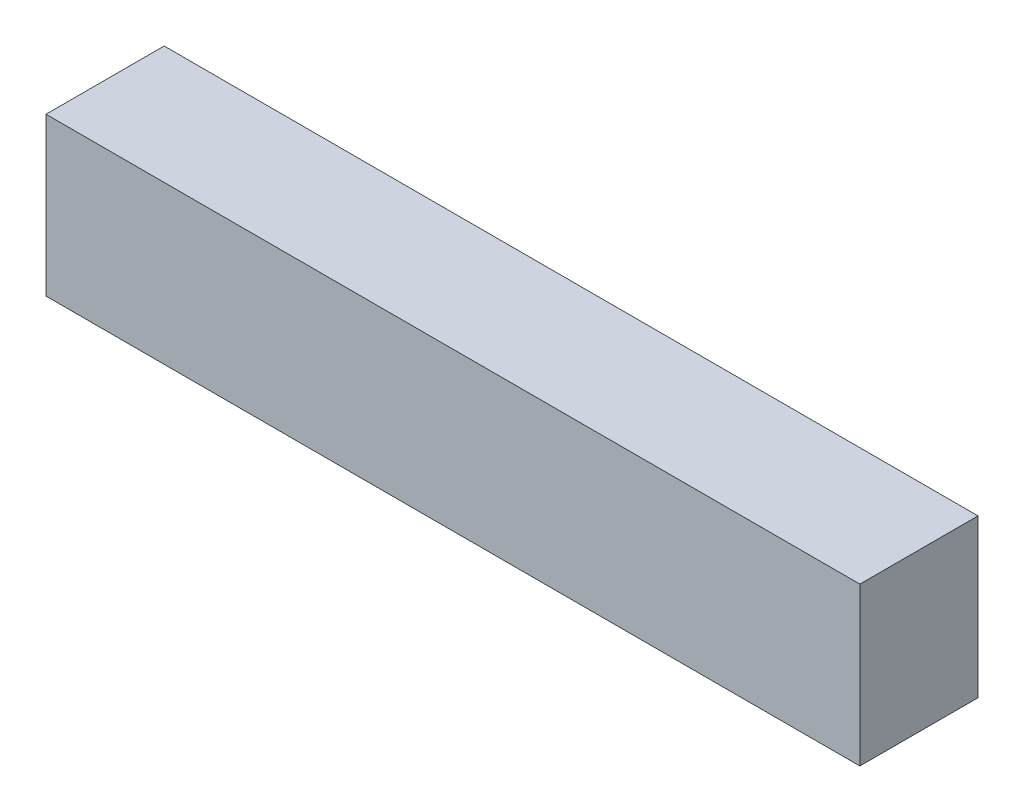
ISO-10303-21;
HEADER;
FILE_DESCRIPTION(('STEP AP214'),'2;1');
FILE_NAME('part.step','',(''),(''),'','','');
FILE_SCHEMA(('AUTOMOTIVE_DESIGN { 1 0 10303 214 1 1 1 1 }'));
ENDSEC;
DATA;
#1=APPLICATION_CONTEXT('core data for automotive mechanical design processes');
#2=APPLICATION_PROTOCOL_DEFINITION('international standard','automotive_design',2000,#1);
#3=PRODUCT_CONTEXT('',#1,'mechanical');
#4=PRODUCT('Part','Part','',(#3));
#5=PRODUCT_RELATED_PRODUCT_CATEGORY('part','',(#4));
#6=PRODUCT_DEFINITION_FORMATION('','',#4);
#7=PRODUCT_DEFINITION_CONTEXT('part definition',#1,'design');
#8=PRODUCT_DEFINITION('design','',#6,#7);
#9=PRODUCT_DEFINITION_SHAPE('','',#8);
#10=(LENGTH_UNIT() NAMED_UNIT(*) SI_UNIT(.MILLI.,.METRE.));
#11=(NAMED_UNIT(*) PLANE_ANGLE_UNIT() SI_UNIT($,.RADIAN.));
#12=(NAMED_UNIT(*) SI_UNIT($,.STERADIAN.) SOLID_ANGLE_UNIT());
#13=UNCERTAINTY_MEASURE_WITH_UNIT(LENGTH_MEASURE(1.E-05),#10,'distance_accuracy_value','');
#14=(GEOMETRIC_REPRESENTATION_CONTEXT(3) GLOBAL_UNCERTAINTY_ASSIGNED_CONTEXT((#13)) GLOBAL_UNIT_ASSIGNED_CONTEXT((#10,
#11,#12)) REPRESENTATION_CONTEXT('',''));
#15=CARTESIAN_POINT('',(0.,0.,0.));
#16=DIRECTION('',(0.,0.,1.));
#17=DIRECTION('',(1.,0.,0.));
#18=AXIS2_PLACEMENT_3D('',#15,#16,#17);
#19=CARTESIAN_POINT('',(450.,470.,-10.));
#20=DIRECTION('',(0.,1.,0.));
#21=DIRECTION('',(0.,0.,1.));
#22=AXIS2_PLACEMENT_3D('',#19,#20,#21);
#23=PLANE('',#22);
#24=DIRECTION('',(0.,0.,-1.));
#25=VECTOR('',#24,1.);
#26=CARTESIAN_POINT('',(200.,470.,0.));
#27=LINE('',#26,#25);
#28=CARTESIAN_POINT('',(200.,470.,225.));
#29=VERTEX_POINT('',#28);
#30=CARTESIAN_POINT('',(200.,470.,0.));
#31=VERTEX_POINT('',#30);
#32=EDGE_CURVE('E455',#29,#31,#27,.T.);
#33=ORIENTED_EDGE('',*,*,#32,.F.);
#34=DIRECTION('',(-1.,0.,0.));
#35=VECTOR('',#34,1.);
#36=CARTESIAN_POINT('',(450.,470.,225.));
#37=LINE('',#36,#35);
#38=CARTESIAN_POINT('',(0.,470.,225.));
#39=VERTEX_POINT('',#38);
#40=EDGE_CURVE('E219',#29,#39,#37,.T.);
#41=ORIENTED_EDGE('',*,*,#40,.T.);
#42=DIRECTION('',(0.,0.,1.));
#43=VECTOR('',#42,1.);
#44=CARTESIAN_POINT('',(0.,470.,900.));
#45=LINE('',#44,#43);
#46=CARTESIAN_POINT('',(0.,470.,0.));
#47=VERTEX_POINT('',#46);
#48=EDGE_CURVE('E221',#47,#39,#45,.T.);
#49=ORIENTED_EDGE('',*,*,#48,.F.);
#50=DIRECTION('',(-1.,0.,0.));
#51=VECTOR('',#50,1.);
#52=CARTESIAN_POINT('',(300.,470.,0.));
#53=LINE('',#52,#51);
#54=EDGE_CURVE('E287',#31,#47,#53,.T.);
#55=ORIENTED_EDGE('',*,*,#54,.F.);
#56=EDGE_LOOP('',(#33,#41,#49,#55));
#57=FACE_BOUND('',#56,.T.);
#58=ADVANCED_FACE('F57',(#57),#23,.F.);
#59=CARTESIAN_POINT('',(450.,470.,225.));
#60=DIRECTION('',(0.,0.,-1.));
#61=DIRECTION('',(-1.,0.,0.));
#62=AXIS2_PLACEMENT_3D('',#59,#60,#61);
#63=PLANE('',#62);
#64=DIRECTION('',(0.,-1.,0.));
#65=VECTOR('',#64,1.);
#66=CARTESIAN_POINT('',(200.,470.,225.));
#67=LINE('',#66,#65);
#68=CARTESIAN_POINT('',(200.,820.,225.));
#69=VERTEX_POINT('',#68);
#70=EDGE_CURVE('E426',#69,#29,#67,.T.);
#71=ORIENTED_EDGE('',*,*,#70,.F.);
#72=DIRECTION('',(-1.,0.,0.));
#73=VECTOR('',#72,1.);
#74=CARTESIAN_POINT('',(450.,820.,225.));
#75=LINE('',#74,#73);
#76=CARTESIAN_POINT('',(0.,820.,225.));
#77=VERTEX_POINT('',#76);
#78=EDGE_CURVE('E421',#69,#77,#75,.T.);
#79=ORIENTED_EDGE('',*,*,#78,.T.);
#80=DIRECTION('',(0.,1.,0.));
#81=VECTOR('',#80,1.);
#82=CARTESIAN_POINT('',(0.,1200.,225.));
#83=LINE('',#82,#81);
#84=EDGE_CURVE('E290',#39,#77,#83,.T.);
#85=ORIENTED_EDGE('',*,*,#84,.F.);
#86=ORIENTED_EDGE('',*,*,#40,.F.);
#87=EDGE_LOOP('',(#71,#79,#85,#86));
#88=FACE_BOUND('',#87,.T.);
#89=ADVANCED_FACE('F349',(#88),#63,.F.);
#90=CARTESIAN_POINT('',(450.,820.,-10.));
#91=DIRECTION('',(0.,-1.,0.));
#92=DIRECTION('',(0.,0.,-1.));
#93=AXIS2_PLACEMENT_3D('',#90,#91,#92);
#94=PLANE('',#93);
#95=DIRECTION('',(0.,0.,1.));
#96=VECTOR('',#95,1.);
#97=CARTESIAN_POINT('',(200.,820.,0.));
#98=LINE('',#97,#96);
#99=CARTESIAN_POINT('',(200.,820.,0.));
#100=VERTEX_POINT('',#99);
#101=EDGE_CURVE('E212',#100,#69,#98,.T.);
#102=ORIENTED_EDGE('',*,*,#101,.F.);
#103=DIRECTION('',(1.,0.,0.));
#104=VECTOR('',#103,1.);
#105=CARTESIAN_POINT('',(300.,820.,0.));
#106=LINE('',#105,#104);
#107=CARTESIAN_POINT('',(0.,820.,0.));
#108=VERTEX_POINT('',#107);
#109=EDGE_CURVE('E284',#108,#100,#106,.T.);
#110=ORIENTED_EDGE('',*,*,#109,.F.);
#111=DIRECTION('',(0.,0.,-1.));
#112=VECTOR('',#111,1.);
#113=CARTESIAN_POINT('',(0.,820.,900.));
#114=LINE('',#113,#112);
#115=EDGE_CURVE('E218',#77,#108,#114,.T.);
#116=ORIENTED_EDGE('',*,*,#115,.F.);
#117=ORIENTED_EDGE('',*,*,#78,.F.);
#118=EDGE_LOOP('',(#102,#110,#116,#117));
#119=FACE_BOUND('',#118,.T.);
#120=ADVANCED_FACE('F356',(#119),#94,.F.);
#121=CARTESIAN_POINT('',(22000.,0.,0.));
#122=DIRECTION('',(0.,0.,1.));
#123=DIRECTION('',(1.,0.,0.));
#124=AXIS2_PLACEMENT_3D('',#121,#122,#123);
#125=PLANE('',#124);
#126=DIRECTION('',(0.,1.,0.));
#127=VECTOR('',#126,1.);
#128=CARTESIAN_POINT('',(-9000.,0.,0.));
#129=LINE('',#128,#127);
#130=CARTESIAN_POINT('',(-9000.,0.,0.));
#131=VERTEX_POINT('',#130);
#132=CARTESIAN_POINT('',(-9000.,6000.,0.));
#133=VERTEX_POINT('',#132);
#134=EDGE_CURVE('E310',#131,#133,#129,.T.);
#135=ORIENTED_EDGE('',*,*,#134,.T.);
#136=DIRECTION('',(-1.,0.,0.));
#137=VECTOR('',#136,1.);
#138=CARTESIAN_POINT('',(22000.,6000.,0.));
#139=LINE('',#138,#137);
#140=CARTESIAN_POINT('',(22000.,6000.,0.));
#141=VERTEX_POINT('',#140);
#142=EDGE_CURVE('E315',#141,#133,#139,.T.);
#143=ORIENTED_EDGE('',*,*,#142,.F.);
#144=DIRECTION('',(0.,1.,0.));
#145=VECTOR('',#144,1.);
#146=CARTESIAN_POINT('',(22000.,0.,0.));
#147=LINE('',#146,#145);
#148=CARTESIAN_POINT('',(22000.,0.,0.));
#149=VERTEX_POINT('',#148);
#150=EDGE_CURVE('E301',#149,#141,#147,.T.);
#151=ORIENTED_EDGE('',*,*,#150,.F.);
#152=DIRECTION('',(-1.,0.,0.));
#153=VECTOR('',#152,1.);
#154=CARTESIAN_POINT('',(22000.,0.,0.));
#155=LINE('',#154,#153);
#156=EDGE_CURVE('E65',#149,#131,#155,.T.);
#157=ORIENTED_EDGE('',*,*,#156,.T.);
#158=EDGE_LOOP('',(#135,#143,#151,#157));
#159=FACE_BOUND('',#158,.T.);
#160=CARTESIAN_POINT('',(300.000000000001,470.,0.));
#161=VERTEX_POINT('',#160);
#162=CARTESIAN_POINT('',(225.,470.,0.));
#163=VERTEX_POINT('',#162);
#164=EDGE_CURVE('E288',#161,#163,#53,.T.);
#165=ORIENTED_EDGE('',*,*,#164,.T.);
#166=DIRECTION('',(0.,1.,0.));
#167=VECTOR('',#166,1.);
#168=CARTESIAN_POINT('',(225.,470.,0.));
#169=LINE('',#168,#167);
#170=CARTESIAN_POINT('',(225.,820.,0.));
#171=VERTEX_POINT('',#170);
#172=EDGE_CURVE('E198',#163,#171,#169,.T.);
#173=ORIENTED_EDGE('',*,*,#172,.T.);
#174=CARTESIAN_POINT('',(450.,820.,0.));
#175=VERTEX_POINT('',#174);
#176=EDGE_CURVE('E283',#171,#175,#106,.T.);
#177=ORIENTED_EDGE('',*,*,#176,.T.);
#178=DIRECTION('',(0.,1.,0.));
#179=VECTOR('',#178,1.);
#180=CARTESIAN_POINT('',(450.,450.,0.));
#181=LINE('',#180,#179);
#182=CARTESIAN_POINT('',(449.999999999999,150.,0.));
#183=VERTEX_POINT('',#182);
#184=EDGE_CURVE('E280',#183,#175,#181,.T.);
#185=ORIENTED_EDGE('',*,*,#184,.F.);
#186=DIRECTION('',(1.,0.,0.));
#187=VECTOR('',#186,1.);
#188=CARTESIAN_POINT('',(300.,150.,0.));
#189=LINE('',#188,#187);
#190=CARTESIAN_POINT('',(4400.,150.,0.));
#191=VERTEX_POINT('',#190);
#192=EDGE_CURVE('E248',#183,#191,#189,.T.);
#193=ORIENTED_EDGE('',*,*,#192,.T.);
#194=DIRECTION('',(0.,1.,0.));
#195=VECTOR('',#194,1.);
#196=CARTESIAN_POINT('',(4400.,150.,0.));
#197=LINE('',#196,#195);
#198=CARTESIAN_POINT('',(4400.,1126.953873476,0.));
#199=VERTEX_POINT('',#198);
#200=EDGE_CURVE('E251',#191,#199,#197,.T.);
#201=ORIENTED_EDGE('',*,*,#200,.T.);
#202=DIRECTION('',(-0.90630778703665,0.422618261740699,0.));
#203=VECTOR('',#202,1.);
#204=CARTESIAN_POINT('',(4400.,1126.953873476,0.));
#205=LINE('',#204,#203);
#206=CARTESIAN_POINT('',(3600.,1500.,0.));
#207=VERTEX_POINT('',#206);
#208=EDGE_CURVE('E254',#199,#207,#205,.T.);
#209=ORIENTED_EDGE('',*,*,#208,.T.);
#210=DIRECTION('',(-1.,0.,0.));
#211=VECTOR('',#210,1.);
#212=CARTESIAN_POINT('',(3600.,1500.,0.));
#213=LINE('',#212,#211);
#214=CARTESIAN_POINT('',(300.,1500.,0.));
#215=VERTEX_POINT('',#214);
#216=EDGE_CURVE('E257',#207,#215,#213,.T.);
#217=ORIENTED_EDGE('',*,*,#216,.T.);
#218=CARTESIAN_POINT('',(300.,1200.,0.));
#219=DIRECTION('',(0.,0.,1.));
#220=DIRECTION('',(1.,0.,0.));
#221=AXIS2_PLACEMENT_3D('',#218,#219,#220);
#222=CIRCLE('',#221,300.);
#223=CARTESIAN_POINT('',(0.,1200.,0.));
#224=VERTEX_POINT('',#223);
#225=EDGE_CURVE('E260',#215,#224,#222,.T.);
#226=ORIENTED_EDGE('',*,*,#225,.T.);
#227=DIRECTION('',(0.,-1.,0.));
#228=VECTOR('',#227,1.);
#229=CARTESIAN_POINT('',(0.,1200.,0.));
#230=LINE('',#229,#228);
#231=EDGE_CURVE('E233',#224,#108,#230,.T.);
#232=ORIENTED_EDGE('',*,*,#231,.T.);
#233=ORIENTED_EDGE('',*,*,#109,.T.);
#234=DIRECTION('',(0.,1.,0.));
#235=VECTOR('',#234,1.);
#236=CARTESIAN_POINT('',(200.,470.,0.));
#237=LINE('',#236,#235);
#238=EDGE_CURVE('E72',#31,#100,#237,.T.);
#239=ORIENTED_EDGE('',*,*,#238,.F.);
#240=ORIENTED_EDGE('',*,*,#54,.T.);
#241=CARTESIAN_POINT('',(0.,450.,0.));
#242=VERTEX_POINT('',#241);
#243=EDGE_CURVE('E263',#47,#242,#230,.T.);
#244=ORIENTED_EDGE('',*,*,#243,.T.);
#245=CARTESIAN_POINT('',(300.,450.,0.));
#246=DIRECTION('',(0.,0.,1.));
#247=DIRECTION('',(1.,0.,0.));
#248=AXIS2_PLACEMENT_3D('',#245,#246,#247);
#249=CIRCLE('',#248,300.);
#250=CARTESIAN_POINT('',(300.,150.,0.));
#251=VERTEX_POINT('',#250);
#252=EDGE_CURVE('E228',#242,#251,#249,.T.);
#253=ORIENTED_EDGE('',*,*,#252,.T.);
#254=DIRECTION('',(0.,1.,0.));
#255=VECTOR('',#254,1.);
#256=CARTESIAN_POINT('',(300.,450.,0.));
#257=LINE('',#256,#255);
#258=EDGE_CURVE('E418',#251,#161,#257,.T.);
#259=ORIENTED_EDGE('',*,*,#258,.T.);
#260=EDGE_LOOP('',(#165,#173,#177,#185,#193,#201,#209,#217,#226,#232,#233,#239,#240,#244,#253,#259));
#261=FACE_BOUND('',#260,.T.);
#262=ADVANCED_FACE('F322',(#159,#261),#125,.F.);
#263=CARTESIAN_POINT('',(22000.,0.,4500.));
#264=DIRECTION('',(0.,0.,-1.));
#265=DIRECTION('',(-1.,0.,0.));
#266=AXIS2_PLACEMENT_3D('',#263,#264,#265);
#267=PLANE('',#266);
#268=DIRECTION('',(0.,-1.,0.));
#269=VECTOR('',#268,1.);
#270=CARTESIAN_POINT('',(-9000.,0.,4500.));
#271=LINE('',#270,#269);
#272=CARTESIAN_POINT('',(-9000.,6000.,4500.));
#273=VERTEX_POINT('',#272);
#274=CARTESIAN_POINT('',(-9000.,0.,4500.));
#275=VERTEX_POINT('',#274);
#276=EDGE_CURVE('E294',#273,#275,#271,.T.);
#277=ORIENTED_EDGE('',*,*,#276,.T.);
#278=DIRECTION('',(-1.,0.,0.));
#279=VECTOR('',#278,1.);
#280=CARTESIAN_POINT('',(22000.,0.,4500.));
#281=LINE('',#280,#279);
#282=CARTESIAN_POINT('',(22000.,0.,4500.));
#283=VERTEX_POINT('',#282);
#284=EDGE_CURVE('E12',#283,#275,#281,.T.);
#285=ORIENTED_EDGE('',*,*,#284,.F.);
#286=DIRECTION('',(0.,-1.,0.));
#287=VECTOR('',#286,1.);
#288=CARTESIAN_POINT('',(22000.,0.,4500.));
#289=LINE('',#288,#287);
#290=CARTESIAN_POINT('',(22000.,6000.,4500.));
#291=VERTEX_POINT('',#290);
#292=EDGE_CURVE('E295',#291,#283,#289,.T.);
#293=ORIENTED_EDGE('',*,*,#292,.F.);
#294=DIRECTION('',(-1.,0.,0.));
#295=VECTOR('',#294,1.);
#296=CARTESIAN_POINT('',(22000.,6000.,4500.));
#297=LINE('',#296,#295);
#298=EDGE_CURVE('E305',#291,#273,#297,.T.);
#299=ORIENTED_EDGE('',*,*,#298,.T.);
#300=EDGE_LOOP('',(#277,#285,#293,#299));
#301=FACE_BOUND('',#300,.T.);
#302=ADVANCED_FACE('F59',(#301),#267,.F.);
#303=CARTESIAN_POINT('',(22000.,0.,0.));
#304=DIRECTION('',(0.,1.,0.));
#305=DIRECTION('',(0.,0.,1.));
#306=AXIS2_PLACEMENT_3D('',#303,#304,#305);
#307=PLANE('',#306);
#308=DIRECTION('',(0.,0.,-1.));
#309=VECTOR('',#308,1.);
#310=CARTESIAN_POINT('',(-9000.,0.,0.));
#311=LINE('',#310,#309);
#312=EDGE_CURVE('E308',#275,#131,#311,.T.);
#313=ORIENTED_EDGE('',*,*,#312,.T.);
#314=ORIENTED_EDGE('',*,*,#156,.F.);
#315=DIRECTION('',(0.,0.,-1.));
#316=VECTOR('',#315,1.);
#317=CARTESIAN_POINT('',(22000.,0.,0.));
#318=LINE('',#317,#316);
#319=EDGE_CURVE('E298',#283,#149,#318,.T.);
#320=ORIENTED_EDGE('',*,*,#319,.F.);
#321=ORIENTED_EDGE('',*,*,#284,.T.);
#322=EDGE_LOOP('',(#313,#314,#320,#321));
#323=FACE_BOUND('',#322,.T.);
#324=ADVANCED_FACE('F339',(#323),#307,.F.);
#325=CARTESIAN_POINT('',(22000.,6000.,0.));
#326=DIRECTION('',(0.,-1.,0.));
#327=DIRECTION('',(0.,0.,-1.));
#328=AXIS2_PLACEMENT_3D('',#325,#326,#327);
#329=PLANE('',#328);
#330=DIRECTION('',(0.,0.,1.));
#331=VECTOR('',#330,1.);
#332=CARTESIAN_POINT('',(-9000.,6000.,0.));
#333=LINE('',#332,#331);
#334=EDGE_CURVE('E299',#133,#273,#333,.T.);
#335=ORIENTED_EDGE('',*,*,#334,.T.);
#336=ORIENTED_EDGE('',*,*,#298,.F.);
#337=DIRECTION('',(0.,0.,1.));
#338=VECTOR('',#337,1.);
#339=CARTESIAN_POINT('',(22000.,6000.,0.));
#340=LINE('',#339,#338);
#341=EDGE_CURVE('E303',#141,#291,#340,.T.);
#342=ORIENTED_EDGE('',*,*,#341,.F.);
#343=ORIENTED_EDGE('',*,*,#142,.T.);
#344=EDGE_LOOP('',(#335,#336,#342,#343));
#345=FACE_BOUND('',#344,.T.);
#346=ADVANCED_FACE('F332',(#345),#329,.F.);
#347=CARTESIAN_POINT('',(22000.,0.,0.));
#348=DIRECTION('',(1.,0.,0.));
#349=DIRECTION('',(0.,0.,-1.));
#350=AXIS2_PLACEMENT_3D('',#347,#348,#349);
#351=PLANE('',#350);
#352=ORIENTED_EDGE('',*,*,#292,.T.);
#353=ORIENTED_EDGE('',*,*,#319,.T.);
#354=ORIENTED_EDGE('',*,*,#150,.T.);
#355=ORIENTED_EDGE('',*,*,#341,.T.);
#356=EDGE_LOOP('',(#352,#353,#354,#355));
#357=FACE_BOUND('',#356,.T.);
#358=ADVANCED_FACE('F338',(#357),#351,.T.);
#359=CARTESIAN_POINT('',(-9000.,0.,0.));
#360=DIRECTION('',(1.,0.,0.));
#361=DIRECTION('',(0.,0.,-1.));
#362=AXIS2_PLACEMENT_3D('',#359,#360,#361);
#363=PLANE('',#362);
#364=ORIENTED_EDGE('',*,*,#276,.F.);
#365=ORIENTED_EDGE('',*,*,#334,.F.);
#366=ORIENTED_EDGE('',*,*,#134,.F.);
#367=ORIENTED_EDGE('',*,*,#312,.F.);
#368=EDGE_LOOP('',(#364,#365,#366,#367));
#369=FACE_BOUND('',#368,.T.);
#370=ADVANCED_FACE('F329',(#369),#363,.F.);
#371=CARTESIAN_POINT('',(300.,150.,900.));
#372=DIRECTION('',(0.,1.,0.));
#373=DIRECTION('',(0.,0.,1.));
#374=AXIS2_PLACEMENT_3D('',#371,#372,#373);
#375=PLANE('',#374);
#376=DIRECTION('',(-1.,0.,0.));
#377=VECTOR('',#376,1.);
#378=CARTESIAN_POINT('',(300.,150.,225.));
#379=LINE('',#378,#377);
#380=CARTESIAN_POINT('',(450.,150.,225.));
#381=VERTEX_POINT('',#380);
#382=CARTESIAN_POINT('',(300.,150.,225.));
#383=VERTEX_POINT('',#382);
#384=EDGE_CURVE('E445',#381,#383,#379,.T.);
#385=ORIENTED_EDGE('',*,*,#384,.T.);
#386=DIRECTION('',(0.,0.,-1.));
#387=VECTOR('',#386,1.);
#388=CARTESIAN_POINT('',(300.,150.,900.));
#389=LINE('',#388,#387);
#390=CARTESIAN_POINT('',(300.,150.,900.));
#391=VERTEX_POINT('',#390);
#392=EDGE_CURVE('E277',#391,#383,#389,.T.);
#393=ORIENTED_EDGE('',*,*,#392,.F.);
#394=DIRECTION('',(1.,0.,0.));
#395=VECTOR('',#394,1.);
#396=CARTESIAN_POINT('',(300.,150.,900.));
#397=LINE('',#396,#395);
#398=CARTESIAN_POINT('',(4400.,150.,900.));
#399=VERTEX_POINT('',#398);
#400=EDGE_CURVE('E232',#391,#399,#397,.T.);
#401=ORIENTED_EDGE('',*,*,#400,.T.);
#402=DIRECTION('',(0.,0.,-1.));
#403=VECTOR('',#402,1.);
#404=CARTESIAN_POINT('',(4400.,150.,900.));
#405=LINE('',#404,#403);
#406=EDGE_CURVE('E275',#399,#191,#405,.T.);
#407=ORIENTED_EDGE('',*,*,#406,.T.);
#408=ORIENTED_EDGE('',*,*,#192,.F.);
#409=DIRECTION('',(0.,0.,-1.));
#410=VECTOR('',#409,1.);
#411=CARTESIAN_POINT('',(450.,150.,900.));
#412=LINE('',#411,#410);
#413=EDGE_CURVE('E412',#381,#183,#412,.T.);
#414=ORIENTED_EDGE('',*,*,#413,.F.);
#415=EDGE_LOOP('',(#385,#393,#401,#407,#408,#414));
#416=FACE_BOUND('',#415,.T.);
#417=ADVANCED_FACE('F363',(#416),#375,.T.);
#418=CARTESIAN_POINT('',(300.,470.,225.));
#419=VERTEX_POINT('',#418);
#420=CARTESIAN_POINT('',(225.,470.,225.));
#421=VERTEX_POINT('',#420);
#422=EDGE_CURVE('E208',#419,#421,#37,.T.);
#423=ORIENTED_EDGE('',*,*,#422,.T.);
#424=DIRECTION('',(0.,0.,-1.));
#425=VECTOR('',#424,1.);
#426=CARTESIAN_POINT('',(225.,470.,0.));
#427=LINE('',#426,#425);
#428=EDGE_CURVE('E195',#421,#163,#427,.T.);
#429=ORIENTED_EDGE('',*,*,#428,.T.);
#430=ORIENTED_EDGE('',*,*,#164,.F.);
#431=DIRECTION('',(0.,0.,-1.));
#432=VECTOR('',#431,1.);
#433=CARTESIAN_POINT('',(300.,470.,-10.));
#434=LINE('',#433,#432);
#435=EDGE_CURVE('E216',#419,#161,#434,.T.);
#436=ORIENTED_EDGE('',*,*,#435,.F.);
#437=EDGE_LOOP('',(#423,#429,#430,#436));
#438=FACE_BOUND('',#437,.T.);
#439=ADVANCED_FACE('F214',(#438),#23,.F.);
#440=CARTESIAN_POINT('',(0.,1200.,900.));
#441=DIRECTION('',(1.,0.,0.));
#442=DIRECTION('',(0.,0.,-1.));
#443=AXIS2_PLACEMENT_3D('',#440,#441,#442);
#444=PLANE('',#443);
#445=ORIENTED_EDGE('',*,*,#48,.T.);
#446=ORIENTED_EDGE('',*,*,#84,.T.);
#447=ORIENTED_EDGE('',*,*,#115,.T.);
#448=ORIENTED_EDGE('',*,*,#231,.F.);
#449=DIRECTION('',(0.,0.,-1.));
#450=VECTOR('',#449,1.);
#451=CARTESIAN_POINT('',(0.,1200.,900.));
#452=LINE('',#451,#450);
#453=CARTESIAN_POINT('',(0.,1200.,900.));
#454=VERTEX_POINT('',#453);
#455=EDGE_CURVE('E267',#454,#224,#452,.T.);
#456=ORIENTED_EDGE('',*,*,#455,.F.);
#457=DIRECTION('',(0.,-1.,0.));
#458=VECTOR('',#457,1.);
#459=CARTESIAN_POINT('',(0.,1200.,900.));
#460=LINE('',#459,#458);
#461=CARTESIAN_POINT('',(0.,450.,900.));
#462=VERTEX_POINT('',#461);
#463=EDGE_CURVE('E243',#454,#462,#460,.T.);
#464=ORIENTED_EDGE('',*,*,#463,.T.);
#465=DIRECTION('',(0.,0.,-1.));
#466=VECTOR('',#465,1.);
#467=CARTESIAN_POINT('',(0.,450.,900.));
#468=LINE('',#467,#466);
#469=EDGE_CURVE('E245',#462,#242,#468,.T.);
#470=ORIENTED_EDGE('',*,*,#469,.T.);
#471=ORIENTED_EDGE('',*,*,#243,.F.);
#472=EDGE_LOOP('',(#445,#446,#447,#448,#456,#464,#470,#471));
#473=FACE_BOUND('',#472,.T.);
#474=ADVANCED_FACE('F362',(#473),#444,.T.);
#475=CARTESIAN_POINT('',(300.,450.,900.));
#476=DIRECTION('',(0.,0.,-1.));
#477=DIRECTION('',(-1.,0.,0.));
#478=AXIS2_PLACEMENT_3D('',#475,#476,#477);
#479=CYLINDRICAL_SURFACE('',#478,300.);
#480=ORIENTED_EDGE('',*,*,#252,.F.);
#481=ORIENTED_EDGE('',*,*,#469,.F.);
#482=CARTESIAN_POINT('',(300.,450.,900.));
#483=DIRECTION('',(0.,0.,1.));
#484=DIRECTION('',(1.,0.,0.));
#485=AXIS2_PLACEMENT_3D('',#482,#483,#484);
#486=CIRCLE('',#485,300.);
#487=EDGE_CURVE('E229',#462,#391,#486,.T.);
#488=ORIENTED_EDGE('',*,*,#487,.T.);
#489=ORIENTED_EDGE('',*,*,#392,.T.);
#490=DIRECTION('',(0.,0.,-1.));
#491=VECTOR('',#490,1.);
#492=CARTESIAN_POINT('',(300.,150.,900.));
#493=LINE('',#492,#491);
#494=EDGE_CURVE('E415',#383,#251,#493,.T.);
#495=ORIENTED_EDGE('',*,*,#494,.T.);
#496=EDGE_LOOP('',(#480,#481,#488,#489,#495));
#497=FACE_BOUND('',#496,.T.);
#498=ADVANCED_FACE('F368',(#497),#479,.F.);
#499=CARTESIAN_POINT('',(4400.,150.,900.));
#500=DIRECTION('',(-1.,0.,0.));
#501=DIRECTION('',(0.,0.,1.));
#502=AXIS2_PLACEMENT_3D('',#499,#500,#501);
#503=PLANE('',#502);
#504=ORIENTED_EDGE('',*,*,#200,.F.);
#505=ORIENTED_EDGE('',*,*,#406,.F.);
#506=DIRECTION('',(0.,1.,0.));
#507=VECTOR('',#506,1.);
#508=CARTESIAN_POINT('',(4400.,150.,900.));
#509=LINE('',#508,#507);
#510=CARTESIAN_POINT('',(4400.,1126.953873476,900.));
#511=VERTEX_POINT('',#510);
#512=EDGE_CURVE('E235',#399,#511,#509,.T.);
#513=ORIENTED_EDGE('',*,*,#512,.T.);
#514=DIRECTION('',(0.,0.,-1.));
#515=VECTOR('',#514,1.);
#516=CARTESIAN_POINT('',(4400.,1126.953873476,900.));
#517=LINE('',#516,#515);
#518=EDGE_CURVE('E273',#511,#199,#517,.T.);
#519=ORIENTED_EDGE('',*,*,#518,.T.);
#520=EDGE_LOOP('',(#504,#505,#513,#519));
#521=FACE_BOUND('',#520,.T.);
#522=ADVANCED_FACE('F380',(#521),#503,.T.);
#523=CARTESIAN_POINT('',(4400.,1126.953873476,900.));
#524=DIRECTION('',(-0.422618261740699,-0.90630778703665,0.));
#525=DIRECTION('',(0.90630778703665,-0.422618261740699,0.));
#526=AXIS2_PLACEMENT_3D('',#523,#524,#525);
#527=PLANE('',#526);
#528=ORIENTED_EDGE('',*,*,#208,.F.);
#529=ORIENTED_EDGE('',*,*,#518,.F.);
#530=DIRECTION('',(-0.90630778703665,0.422618261740699,0.));
#531=VECTOR('',#530,1.);
#532=CARTESIAN_POINT('',(4400.,1126.953873476,900.));
#533=LINE('',#532,#531);
#534=CARTESIAN_POINT('',(3600.,1500.,900.));
#535=VERTEX_POINT('',#534);
#536=EDGE_CURVE('E237',#511,#535,#533,.T.);
#537=ORIENTED_EDGE('',*,*,#536,.T.);
#538=DIRECTION('',(0.,0.,-1.));
#539=VECTOR('',#538,1.);
#540=CARTESIAN_POINT('',(3600.,1500.,900.));
#541=LINE('',#540,#539);
#542=EDGE_CURVE('E271',#535,#207,#541,.T.);
#543=ORIENTED_EDGE('',*,*,#542,.T.);
#544=EDGE_LOOP('',(#528,#529,#537,#543));
#545=FACE_BOUND('',#544,.T.);
#546=ADVANCED_FACE('F538',(#545),#527,.T.);
#547=CARTESIAN_POINT('',(3600.,1500.,900.));
#548=DIRECTION('',(0.,-1.,0.));
#549=DIRECTION('',(0.,0.,-1.));
#550=AXIS2_PLACEMENT_3D('',#547,#548,#549);
#551=PLANE('',#550);
#552=ORIENTED_EDGE('',*,*,#216,.F.);
#553=ORIENTED_EDGE('',*,*,#542,.F.);
#554=DIRECTION('',(-1.,0.,0.));
#555=VECTOR('',#554,1.);
#556=CARTESIAN_POINT('',(3600.,1500.,900.));
#557=LINE('',#556,#555);
#558=CARTESIAN_POINT('',(300.,1500.,900.));
#559=VERTEX_POINT('',#558);
#560=EDGE_CURVE('E239',#535,#559,#557,.T.);
#561=ORIENTED_EDGE('',*,*,#560,.T.);
#562=DIRECTION('',(0.,0.,-1.));
#563=VECTOR('',#562,1.);
#564=CARTESIAN_POINT('',(300.,1500.,900.));
#565=LINE('',#564,#563);
#566=EDGE_CURVE('E269',#559,#215,#565,.T.);
#567=ORIENTED_EDGE('',*,*,#566,.T.);
#568=EDGE_LOOP('',(#552,#553,#561,#567));
#569=FACE_BOUND('',#568,.T.);
#570=ADVANCED_FACE('F528',(#569),#551,.T.);
#571=CARTESIAN_POINT('',(300.,1200.,900.));
#572=DIRECTION('',(0.,0.,-1.));
#573=DIRECTION('',(-1.,0.,0.));
#574=AXIS2_PLACEMENT_3D('',#571,#572,#573);
#575=CYLINDRICAL_SURFACE('',#574,300.);
#576=ORIENTED_EDGE('',*,*,#225,.F.);
#577=ORIENTED_EDGE('',*,*,#566,.F.);
#578=CARTESIAN_POINT('',(300.,1200.,900.));
#579=DIRECTION('',(0.,0.,1.));
#580=DIRECTION('',(1.,0.,0.));
#581=AXIS2_PLACEMENT_3D('',#578,#579,#580);
#582=CIRCLE('',#581,300.);
#583=EDGE_CURVE('E241',#559,#454,#582,.T.);
#584=ORIENTED_EDGE('',*,*,#583,.T.);
#585=ORIENTED_EDGE('',*,*,#455,.T.);
#586=EDGE_LOOP('',(#576,#577,#584,#585));
#587=FACE_BOUND('',#586,.T.);
#588=ADVANCED_FACE('F511',(#587),#575,.F.);
#589=CARTESIAN_POINT('',(300.,450.,900.));
#590=DIRECTION('',(0.,0.,1.));
#591=DIRECTION('',(1.,0.,0.));
#592=AXIS2_PLACEMENT_3D('',#589,#590,#591);
#593=PLANE('',#592);
#594=ORIENTED_EDGE('',*,*,#487,.F.);
#595=ORIENTED_EDGE('',*,*,#463,.F.);
#596=ORIENTED_EDGE('',*,*,#583,.F.);
#597=ORIENTED_EDGE('',*,*,#560,.F.);
#598=ORIENTED_EDGE('',*,*,#536,.F.);
#599=ORIENTED_EDGE('',*,*,#512,.F.);
#600=ORIENTED_EDGE('',*,*,#400,.F.);
#601=EDGE_LOOP('',(#594,#595,#596,#597,#598,#599,#600));
#602=FACE_BOUND('',#601,.T.);
#603=ADVANCED_FACE('F404',(#602),#593,.F.);
#604=CARTESIAN_POINT('',(450.,820.,225.));
#605=VERTEX_POINT('',#604);
#606=CARTESIAN_POINT('',(225.,820.,225.));
#607=VERTEX_POINT('',#606);
#608=EDGE_CURVE('E211',#605,#607,#75,.T.);
#609=ORIENTED_EDGE('',*,*,#608,.T.);
#610=DIRECTION('',(0.,-1.,0.));
#611=VECTOR('',#610,1.);
#612=CARTESIAN_POINT('',(225.,470.,225.));
#613=LINE('',#612,#611);
#614=EDGE_CURVE('E80',#607,#421,#613,.T.);
#615=ORIENTED_EDGE('',*,*,#614,.T.);
#616=ORIENTED_EDGE('',*,*,#422,.F.);
#617=DIRECTION('',(0.,-1.,0.));
#618=VECTOR('',#617,1.);
#619=CARTESIAN_POINT('',(300.,100.,225.));
#620=LINE('',#619,#618);
#621=EDGE_CURVE('E446',#419,#383,#620,.T.);
#622=ORIENTED_EDGE('',*,*,#621,.T.);
#623=ORIENTED_EDGE('',*,*,#384,.F.);
#624=DIRECTION('',(0.,-1.,0.));
#625=VECTOR('',#624,1.);
#626=CARTESIAN_POINT('',(450.,470.,225.));
#627=LINE('',#626,#625);
#628=EDGE_CURVE('E413',#605,#381,#627,.T.);
#629=ORIENTED_EDGE('',*,*,#628,.F.);
#630=EDGE_LOOP('',(#609,#615,#616,#622,#623,#629));
#631=FACE_BOUND('',#630,.T.);
#632=ADVANCED_FACE('F206',(#631),#63,.F.);
#633=ORIENTED_EDGE('',*,*,#176,.F.);
#634=DIRECTION('',(0.,0.,1.));
#635=VECTOR('',#634,1.);
#636=CARTESIAN_POINT('',(225.,820.,0.));
#637=LINE('',#636,#635);
#638=EDGE_CURVE('E407',#171,#607,#637,.T.);
#639=ORIENTED_EDGE('',*,*,#638,.T.);
#640=ORIENTED_EDGE('',*,*,#608,.F.);
#641=DIRECTION('',(0.,0.,1.));
#642=VECTOR('',#641,1.);
#643=CARTESIAN_POINT('',(450.,820.,-10.));
#644=LINE('',#643,#642);
#645=EDGE_CURVE('E408',#175,#605,#644,.T.);
#646=ORIENTED_EDGE('',*,*,#645,.F.);
#647=EDGE_LOOP('',(#633,#639,#640,#646));
#648=FACE_BOUND('',#647,.T.);
#649=ADVANCED_FACE('F391',(#648),#94,.F.);
#650=CARTESIAN_POINT('',(450.,0.,0.));
#651=DIRECTION('',(1.,0.,0.));
#652=DIRECTION('',(0.,0.,-1.));
#653=AXIS2_PLACEMENT_3D('',#650,#651,#652);
#654=PLANE('',#653);
#655=ORIENTED_EDGE('',*,*,#413,.T.);
#656=ORIENTED_EDGE('',*,*,#184,.T.);
#657=ORIENTED_EDGE('',*,*,#645,.T.);
#658=ORIENTED_EDGE('',*,*,#628,.T.);
#659=EDGE_LOOP('',(#655,#656,#657,#658));
#660=FACE_BOUND('',#659,.T.);
#661=ADVANCED_FACE('F396',(#660),#654,.T.);
#662=CARTESIAN_POINT('',(300.,0.,0.));
#663=DIRECTION('',(1.,0.,0.));
#664=DIRECTION('',(0.,0.,-1.));
#665=AXIS2_PLACEMENT_3D('',#662,#663,#664);
#666=PLANE('',#665);
#667=ORIENTED_EDGE('',*,*,#494,.F.);
#668=ORIENTED_EDGE('',*,*,#621,.F.);
#669=ORIENTED_EDGE('',*,*,#435,.T.);
#670=ORIENTED_EDGE('',*,*,#258,.F.);
#671=EDGE_LOOP('',(#667,#668,#669,#670));
#672=FACE_BOUND('',#671,.T.);
#673=ADVANCED_FACE('F402',(#672),#666,.F.);
#674=CARTESIAN_POINT('',(200.,0.,0.));
#675=DIRECTION('',(1.,0.,0.));
#676=DIRECTION('',(0.,0.,-1.));
#677=AXIS2_PLACEMENT_3D('',#674,#675,#676);
#678=PLANE('',#677);
#679=ORIENTED_EDGE('',*,*,#70,.T.);
#680=ORIENTED_EDGE('',*,*,#32,.T.);
#681=ORIENTED_EDGE('',*,*,#238,.T.);
#682=ORIENTED_EDGE('',*,*,#101,.T.);
#683=EDGE_LOOP('',(#679,#680,#681,#682));
#684=FACE_BOUND('',#683,.T.);
#685=ADVANCED_FACE('F461',(#684),#678,.T.);
#686=CARTESIAN_POINT('',(225.,0.,0.));
#687=DIRECTION('',(1.,0.,0.));
#688=DIRECTION('',(0.,0.,-1.));
#689=AXIS2_PLACEMENT_3D('',#686,#687,#688);
#690=PLANE('',#689);
#691=ORIENTED_EDGE('',*,*,#614,.F.);
#692=ORIENTED_EDGE('',*,*,#638,.F.);
#693=ORIENTED_EDGE('',*,*,#172,.F.);
#694=ORIENTED_EDGE('',*,*,#428,.F.);
#695=EDGE_LOOP('',(#691,#692,#693,#694));
#696=FACE_BOUND('',#695,.T.);
#697=ADVANCED_FACE('F196',(#696),#690,.F.);
#698=CLOSED_SHELL('',(#58,#89,#120,#262,#302,#324,#346,#358,#370,#417,#439,#474,#498,#522,#546,
#570,#588,#603,#632,#649,#661,#673,#685,#697));
#699=MANIFOLD_SOLID_BREP('B2',#698);
#700=CARTESIAN_POINT('',(225.,470.,225.));
#701=DIRECTION('',(0.,0.,-1.));
#702=DIRECTION('',(-1.,0.,0.));
#703=AXIS2_PLACEMENT_3D('',#700,#701,#702);
#704=PLANE('',#703);
#705=DIRECTION('',(0.,-1.,0.));
#706=VECTOR('',#705,1.);
#707=CARTESIAN_POINT('',(200.,470.,225.));
#708=LINE('',#707,#706);
#709=CARTESIAN_POINT('',(200.,820.,225.));
#710=VERTEX_POINT('',#709);
#711=CARTESIAN_POINT('',(200.,470.,225.));
#712=VERTEX_POINT('',#711);
#713=EDGE_CURVE('E782',#710,#712,#708,.T.);
#714=ORIENTED_EDGE('',*,*,#713,.T.);
#715=DIRECTION('',(-1.,0.,0.));
#716=VECTOR('',#715,1.);
#717=CARTESIAN_POINT('',(225.,470.,225.));
#718=LINE('',#717,#716);
#719=CARTESIAN_POINT('',(225.,470.,225.));
#720=VERTEX_POINT('',#719);
#721=EDGE_CURVE('E55',#720,#712,#718,.T.);
#722=ORIENTED_EDGE('',*,*,#721,.F.);
#723=DIRECTION('',(0.,-1.,0.));
#724=VECTOR('',#723,1.);
#725=CARTESIAN_POINT('',(225.,470.,225.));
#726=LINE('',#725,#724);
#727=CARTESIAN_POINT('',(225.,820.,225.));
#728=VERTEX_POINT('',#727);
#729=EDGE_CURVE('E770',#728,#720,#726,.T.);
#730=ORIENTED_EDGE('',*,*,#729,.F.);
#731=DIRECTION('',(-1.,0.,0.));
#732=VECTOR('',#731,1.);
#733=CARTESIAN_POINT('',(225.,820.,225.));
#734=LINE('',#733,#732);
#735=EDGE_CURVE('E778',#728,#710,#734,.T.);
#736=ORIENTED_EDGE('',*,*,#735,.T.);
#737=EDGE_LOOP('',(#714,#722,#730,#736));
#738=FACE_BOUND('',#737,.T.);
#739=ADVANCED_FACE('F719',(#738),#704,.F.);
#740=CARTESIAN_POINT('',(225.,470.,0.));
#741=DIRECTION('',(0.,1.,0.));
#742=DIRECTION('',(0.,0.,1.));
#743=AXIS2_PLACEMENT_3D('',#740,#741,#742);
#744=PLANE('',#743);
#745=DIRECTION('',(0.,0.,-1.));
#746=VECTOR('',#745,1.);
#747=CARTESIAN_POINT('',(200.,470.,0.));
#748=LINE('',#747,#746);
#749=CARTESIAN_POINT('',(200.,470.,0.));
#750=VERTEX_POINT('',#749);
#751=EDGE_CURVE('E774',#712,#750,#748,.T.);
#752=ORIENTED_EDGE('',*,*,#751,.T.);
#753=DIRECTION('',(-1.,0.,0.));
#754=VECTOR('',#753,1.);
#755=CARTESIAN_POINT('',(225.,470.,0.));
#756=LINE('',#755,#754);
#757=CARTESIAN_POINT('',(225.,470.,0.));
#758=VERTEX_POINT('',#757);
#759=EDGE_CURVE('E727',#758,#750,#756,.T.);
#760=ORIENTED_EDGE('',*,*,#759,.F.);
#761=DIRECTION('',(0.,0.,-1.));
#762=VECTOR('',#761,1.);
#763=CARTESIAN_POINT('',(225.,470.,0.));
#764=LINE('',#763,#762);
#765=EDGE_CURVE('E765',#720,#758,#764,.T.);
#766=ORIENTED_EDGE('',*,*,#765,.F.);
#767=ORIENTED_EDGE('',*,*,#721,.T.);
#768=EDGE_LOOP('',(#752,#760,#766,#767));
#769=FACE_BOUND('',#768,.T.);
#770=ADVANCED_FACE('F773',(#769),#744,.F.);
#771=CARTESIAN_POINT('',(225.,470.,0.));
#772=DIRECTION('',(0.,0.,1.));
#773=DIRECTION('',(1.,0.,0.));
#774=AXIS2_PLACEMENT_3D('',#771,#772,#773);
#775=PLANE('',#774);
#776=DIRECTION('',(0.,1.,0.));
#777=VECTOR('',#776,1.);
#778=CARTESIAN_POINT('',(200.,470.,0.));
#779=LINE('',#778,#777);
#780=CARTESIAN_POINT('',(200.,820.,0.));
#781=VERTEX_POINT('',#780);
#782=EDGE_CURVE('E752',#750,#781,#779,.T.);
#783=ORIENTED_EDGE('',*,*,#782,.T.);
#784=DIRECTION('',(-1.,0.,0.));
#785=VECTOR('',#784,1.);
#786=CARTESIAN_POINT('',(225.,820.,0.));
#787=LINE('',#786,#785);
#788=CARTESIAN_POINT('',(225.,820.,0.));
#789=VERTEX_POINT('',#788);
#790=EDGE_CURVE('E775',#789,#781,#787,.T.);
#791=ORIENTED_EDGE('',*,*,#790,.F.);
#792=DIRECTION('',(0.,1.,0.));
#793=VECTOR('',#792,1.);
#794=CARTESIAN_POINT('',(225.,470.,0.));
#795=LINE('',#794,#793);
#796=EDGE_CURVE('E768',#758,#789,#795,.T.);
#797=ORIENTED_EDGE('',*,*,#796,.F.);
#798=ORIENTED_EDGE('',*,*,#759,.T.);
#799=EDGE_LOOP('',(#783,#791,#797,#798));
#800=FACE_BOUND('',#799,.T.);
#801=ADVANCED_FACE('F776',(#800),#775,.F.);
#802=CARTESIAN_POINT('',(225.,820.,0.));
#803=DIRECTION('',(0.,-1.,0.));
#804=DIRECTION('',(0.,0.,-1.));
#805=AXIS2_PLACEMENT_3D('',#802,#803,#804);
#806=PLANE('',#805);
#807=DIRECTION('',(0.,0.,1.));
#808=VECTOR('',#807,1.);
#809=CARTESIAN_POINT('',(200.,820.,0.));
#810=LINE('',#809,#808);
#811=EDGE_CURVE('E758',#781,#710,#810,.T.);
#812=ORIENTED_EDGE('',*,*,#811,.T.);
#813=ORIENTED_EDGE('',*,*,#735,.F.);
#814=DIRECTION('',(0.,0.,1.));
#815=VECTOR('',#814,1.);
#816=CARTESIAN_POINT('',(225.,820.,0.));
#817=LINE('',#816,#815);
#818=EDGE_CURVE('E735',#789,#728,#817,.T.);
#819=ORIENTED_EDGE('',*,*,#818,.F.);
#820=ORIENTED_EDGE('',*,*,#790,.T.);
#821=EDGE_LOOP('',(#812,#813,#819,#820));
#822=FACE_BOUND('',#821,.T.);
#823=ADVANCED_FACE('F789',(#822),#806,.F.);
#824=CARTESIAN_POINT('',(225.,0.,0.));
#825=DIRECTION('',(1.,0.,0.));
#826=DIRECTION('',(0.,0.,-1.));
#827=AXIS2_PLACEMENT_3D('',#824,#825,#826);
#828=PLANE('',#827);
#829=ORIENTED_EDGE('',*,*,#729,.T.);
#830=ORIENTED_EDGE('',*,*,#765,.T.);
#831=ORIENTED_EDGE('',*,*,#796,.T.);
#832=ORIENTED_EDGE('',*,*,#818,.T.);
#833=EDGE_LOOP('',(#829,#830,#831,#832));
#834=FACE_BOUND('',#833,.T.);
#835=ADVANCED_FACE('F766',(#834),#828,.T.);
#836=CARTESIAN_POINT('',(200.,0.,0.));
#837=DIRECTION('',(1.,0.,0.));
#838=DIRECTION('',(0.,0.,-1.));
#839=AXIS2_PLACEMENT_3D('',#836,#837,#838);
#840=PLANE('',#839);
#841=ORIENTED_EDGE('',*,*,#713,.F.);
#842=ORIENTED_EDGE('',*,*,#811,.F.);
#843=ORIENTED_EDGE('',*,*,#782,.F.);
#844=ORIENTED_EDGE('',*,*,#751,.F.);
#845=EDGE_LOOP('',(#841,#842,#843,#844));
#846=FACE_BOUND('',#845,.T.);
#847=ADVANCED_FACE('F792',(#846),#840,.F.);
#848=CLOSED_SHELL('',(#739,#770,#801,#823,#835,#847));
#849=MANIFOLD_SOLID_BREP('B6',#848);
#850=ADVANCED_BREP_SHAPE_REPRESENTATION('',(#18,#699,#849),#14);
#851=SHAPE_DEFINITION_REPRESENTATION(#9,#850);
ENDSEC;
END-ISO-10303-21;
